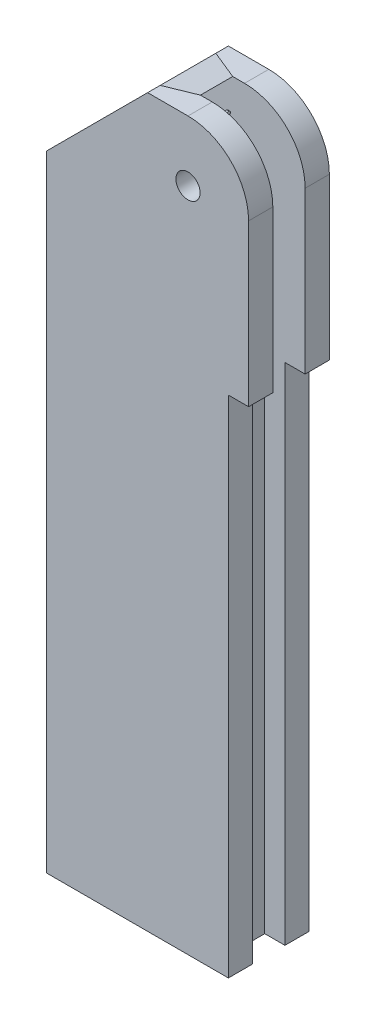
ISO-10303-21;
HEADER;
FILE_DESCRIPTION(('STEP AP214'),'2;1');
FILE_NAME('part.step','',(''),(''),'','','');
FILE_SCHEMA(('AUTOMOTIVE_DESIGN { 1 0 10303 214 1 1 1 1 }'));
ENDSEC;
DATA;
#1=APPLICATION_CONTEXT('core data for automotive mechanical design processes');
#2=APPLICATION_PROTOCOL_DEFINITION('international standard','automotive_design',2000,#1);
#3=PRODUCT_CONTEXT('',#1,'mechanical');
#4=PRODUCT('Part','Part','',(#3));
#5=PRODUCT_RELATED_PRODUCT_CATEGORY('part','',(#4));
#6=PRODUCT_DEFINITION_FORMATION('','',#4);
#7=PRODUCT_DEFINITION_CONTEXT('part definition',#1,'design');
#8=PRODUCT_DEFINITION('design','',#6,#7);
#9=PRODUCT_DEFINITION_SHAPE('','',#8);
#10=(LENGTH_UNIT() NAMED_UNIT(*) SI_UNIT(.MILLI.,.METRE.));
#11=(NAMED_UNIT(*) PLANE_ANGLE_UNIT() SI_UNIT($,.RADIAN.));
#12=(NAMED_UNIT(*) SI_UNIT($,.STERADIAN.) SOLID_ANGLE_UNIT());
#13=UNCERTAINTY_MEASURE_WITH_UNIT(LENGTH_MEASURE(1.E-05),#10,'distance_accuracy_value','');
#14=(GEOMETRIC_REPRESENTATION_CONTEXT(3) GLOBAL_UNCERTAINTY_ASSIGNED_CONTEXT((#13)) GLOBAL_UNIT_ASSIGNED_CONTEXT((#10,
#11,#12)) REPRESENTATION_CONTEXT('',''));
#15=CARTESIAN_POINT('',(0.,0.,0.));
#16=DIRECTION('',(0.,0.,1.));
#17=DIRECTION('',(1.,0.,0.));
#18=AXIS2_PLACEMENT_3D('',#15,#16,#17);
#19=CARTESIAN_POINT('',(-0.5,10.5,0.));
#20=DIRECTION('',(1.,0.,0.));
#21=DIRECTION('',(0.,0.,-1.));
#22=AXIS2_PLACEMENT_3D('',#19,#20,#21);
#23=CYLINDRICAL_SURFACE('',#22,0.5);
#24=CARTESIAN_POINT('',(-0.5,10.5,0.));
#25=DIRECTION('',(1.,0.,0.));
#26=DIRECTION('',(0.,0.,-1.));
#27=AXIS2_PLACEMENT_3D('',#24,#25,#26);
#28=CIRCLE('',#27,0.5);
#29=CARTESIAN_POINT('',(-0.5,10.5,-0.5));
#30=VERTEX_POINT('',#29);
#31=EDGE_CURVE('E11',#30,#30,#28,.T.);
#32=ORIENTED_EDGE('',*,*,#31,.T.);
#33=EDGE_LOOP('',(#32));
#34=FACE_BOUND('',#33,.T.);
#35=CARTESIAN_POINT('',(0.,10.5,0.));
#36=DIRECTION('',(1.,0.,0.));
#37=DIRECTION('',(0.,0.,-1.));
#38=AXIS2_PLACEMENT_3D('',#35,#36,#37);
#39=CIRCLE('',#38,0.5);
#40=CARTESIAN_POINT('',(0.,10.5,-0.5));
#41=VERTEX_POINT('',#40);
#42=EDGE_CURVE('E56',#41,#41,#39,.T.);
#43=ORIENTED_EDGE('',*,*,#42,.F.);
#44=EDGE_LOOP('',(#43));
#45=FACE_BOUND('',#44,.T.);
#46=ADVANCED_FACE('F49',(#34,#45),#23,.T.);
#47=CARTESIAN_POINT('',(-0.5,10.5,0.));
#48=DIRECTION('',(1.,0.,0.));
#49=DIRECTION('',(0.,0.,-1.));
#50=AXIS2_PLACEMENT_3D('',#47,#48,#49);
#51=PLANE('',#50);
#52=ORIENTED_EDGE('',*,*,#31,.F.);
#53=EDGE_LOOP('',(#52));
#54=FACE_BOUND('',#53,.T.);
#55=ADVANCED_FACE('F67',(#54),#51,.F.);
#56=CARTESIAN_POINT('',(0.,10.5,0.));
#57=DIRECTION('',(1.,0.,0.));
#58=DIRECTION('',(0.,0.,-1.));
#59=AXIS2_PLACEMENT_3D('',#56,#57,#58);
#60=PLANE('',#59);
#61=ORIENTED_EDGE('',*,*,#42,.T.);
#62=EDGE_LOOP('',(#61));
#63=FACE_BOUND('',#62,.T.);
#64=ADVANCED_FACE('F64',(#63),#60,.T.);
#65=CLOSED_SHELL('',(#46,#55,#64));
#66=MANIFOLD_SOLID_BREP('B2',#65);
#67=CARTESIAN_POINT('',(10.,-39.85,10.));
#68=DIRECTION('',(-1.,0.,0.));
#69=DIRECTION('',(0.,-1.,0.));
#70=AXIS2_PLACEMENT_3D('',#67,#68,#69);
#71=PLANE('',#70);
#72=DIRECTION('',(0.,0.,-1.));
#73=VECTOR('',#72,1.);
#74=CARTESIAN_POINT('',(10.,-39.85,10.));
#75=LINE('',#74,#73);
#76=CARTESIAN_POINT('',(10.,-39.85,-4.));
#77=VERTEX_POINT('',#76);
#78=CARTESIAN_POINT('',(10.,-39.85,-10.));
#79=VERTEX_POINT('',#78);
#80=EDGE_CURVE('E374',#77,#79,#75,.T.);
#81=ORIENTED_EDGE('',*,*,#80,.F.);
#82=DIRECTION('',(0.,-1.,0.));
#83=VECTOR('',#82,1.);
#84=CARTESIAN_POINT('',(10.,-39.85,-4.));
#85=LINE('',#84,#83);
#86=CARTESIAN_POINT('',(10.,-164.85,-4.));
#87=VERTEX_POINT('',#86);
#88=EDGE_CURVE('E453',#77,#87,#85,.T.);
#89=ORIENTED_EDGE('',*,*,#88,.T.);
#90=DIRECTION('',(0.,0.,-1.));
#91=VECTOR('',#90,1.);
#92=CARTESIAN_POINT('',(10.,-164.85,10.));
#93=LINE('',#92,#91);
#94=CARTESIAN_POINT('',(10.,-164.85,-10.));
#95=VERTEX_POINT('',#94);
#96=EDGE_CURVE('E379',#87,#95,#93,.T.);
#97=ORIENTED_EDGE('',*,*,#96,.T.);
#98=DIRECTION('',(0.,1.,0.));
#99=VECTOR('',#98,1.);
#100=CARTESIAN_POINT('',(10.,-39.85,-10.));
#101=LINE('',#100,#99);
#102=EDGE_CURVE('E297',#95,#79,#101,.T.);
#103=ORIENTED_EDGE('',*,*,#102,.T.);
#104=EDGE_LOOP('',(#81,#89,#97,#103));
#105=FACE_BOUND('',#104,.T.);
#106=ADVANCED_FACE('F99',(#105),#71,.F.);
#107=CARTESIAN_POINT('',(15.,-39.85,10.));
#108=DIRECTION('',(0.,1.,0.));
#109=DIRECTION('',(0.,0.,1.));
#110=AXIS2_PLACEMENT_3D('',#107,#108,#109);
#111=PLANE('',#110);
#112=DIRECTION('',(0.,0.,-1.));
#113=VECTOR('',#112,1.);
#114=CARTESIAN_POINT('',(15.,-39.85,10.));
#115=LINE('',#114,#113);
#116=CARTESIAN_POINT('',(15.,-39.85,-4.));
#117=VERTEX_POINT('',#116);
#118=CARTESIAN_POINT('',(15.,-39.85,-10.));
#119=VERTEX_POINT('',#118);
#120=EDGE_CURVE('E369',#117,#119,#115,.T.);
#121=ORIENTED_EDGE('',*,*,#120,.F.);
#122=DIRECTION('',(-1.,0.,0.));
#123=VECTOR('',#122,1.);
#124=CARTESIAN_POINT('',(15.,-39.85,-4.));
#125=LINE('',#124,#123);
#126=EDGE_CURVE('E458',#117,#77,#125,.T.);
#127=ORIENTED_EDGE('',*,*,#126,.T.);
#128=ORIENTED_EDGE('',*,*,#80,.T.);
#129=DIRECTION('',(1.,0.,0.));
#130=VECTOR('',#129,1.);
#131=CARTESIAN_POINT('',(15.,-39.85,-10.));
#132=LINE('',#131,#130);
#133=EDGE_CURVE('E301',#79,#119,#132,.T.);
#134=ORIENTED_EDGE('',*,*,#133,.T.);
#135=EDGE_LOOP('',(#121,#127,#128,#134));
#136=FACE_BOUND('',#135,.T.);
#137=ADVANCED_FACE('F527',(#136),#111,.F.);
#138=CARTESIAN_POINT('',(15.,0.,10.));
#139=DIRECTION('',(-1.,0.,0.));
#140=DIRECTION('',(0.,-1.,0.));
#141=AXIS2_PLACEMENT_3D('',#138,#139,#140);
#142=PLANE('',#141);
#143=DIRECTION('',(0.,1.,0.));
#144=VECTOR('',#143,1.);
#145=CARTESIAN_POINT('',(15.,-15.,-4.));
#146=LINE('',#145,#144);
#147=CARTESIAN_POINT('',(15.,0.,-4.));
#148=VERTEX_POINT('',#147);
#149=EDGE_CURVE('E452',#117,#148,#146,.T.);
#150=ORIENTED_EDGE('',*,*,#149,.F.);
#151=ORIENTED_EDGE('',*,*,#120,.T.);
#152=DIRECTION('',(0.,1.,0.));
#153=VECTOR('',#152,1.);
#154=CARTESIAN_POINT('',(15.,0.,-10.));
#155=LINE('',#154,#153);
#156=CARTESIAN_POINT('',(15.,0.,-10.));
#157=VERTEX_POINT('',#156);
#158=EDGE_CURVE('E305',#119,#157,#155,.T.);
#159=ORIENTED_EDGE('',*,*,#158,.T.);
#160=DIRECTION('',(0.,0.,-1.));
#161=VECTOR('',#160,1.);
#162=CARTESIAN_POINT('',(15.,0.,10.));
#163=LINE('',#162,#161);
#164=EDGE_CURVE('E364',#148,#157,#163,.T.);
#165=ORIENTED_EDGE('',*,*,#164,.F.);
#166=EDGE_LOOP('',(#150,#151,#159,#165));
#167=FACE_BOUND('',#166,.T.);
#168=ADVANCED_FACE('F525',(#167),#142,.F.);
#169=CARTESIAN_POINT('',(0.,0.,10.));
#170=DIRECTION('',(0.,0.,-1.));
#171=DIRECTION('',(-1.,0.,0.));
#172=AXIS2_PLACEMENT_3D('',#169,#170,#171);
#173=CYLINDRICAL_SURFACE('',#172,15.);
#174=CARTESIAN_POINT('',(15.,0.,10.));
#175=VERTEX_POINT('',#174);
#176=CARTESIAN_POINT('',(15.,0.,4.));
#177=VERTEX_POINT('',#176);
#178=EDGE_CURVE('E365',#175,#177,#163,.T.);
#179=ORIENTED_EDGE('',*,*,#178,.T.);
#180=CARTESIAN_POINT('',(0.,0.,4.));
#181=DIRECTION('',(0.,0.,1.));
#182=DIRECTION('',(1.,0.,0.));
#183=AXIS2_PLACEMENT_3D('',#180,#181,#182);
#184=CIRCLE('',#183,15.);
#185=CARTESIAN_POINT('',(0.,15.,4.));
#186=VERTEX_POINT('',#185);
#187=EDGE_CURVE('E281',#177,#186,#184,.T.);
#188=ORIENTED_EDGE('',*,*,#187,.T.);
#189=DIRECTION('',(0.,0.,-1.));
#190=VECTOR('',#189,1.);
#191=CARTESIAN_POINT('',(0.,15.,10.));
#192=LINE('',#191,#190);
#193=CARTESIAN_POINT('',(0.,15.,10.));
#194=VERTEX_POINT('',#193);
#195=EDGE_CURVE('E360',#194,#186,#192,.T.);
#196=ORIENTED_EDGE('',*,*,#195,.F.);
#197=CARTESIAN_POINT('',(0.,0.,10.));
#198=DIRECTION('',(0.,0.,1.));
#199=DIRECTION('',(-1.,0.,0.));
#200=AXIS2_PLACEMENT_3D('',#197,#198,#199);
#201=CIRCLE('',#200,15.);
#202=EDGE_CURVE('E340',#175,#194,#201,.T.);
#203=ORIENTED_EDGE('',*,*,#202,.F.);
#204=EDGE_LOOP('',(#179,#188,#196,#203));
#205=FACE_BOUND('',#204,.T.);
#206=ADVANCED_FACE('F442',(#205),#173,.T.);
#207=CARTESIAN_POINT('',(-10.,15.,10.));
#208=DIRECTION('',(0.,-1.,0.));
#209=DIRECTION('',(1.,0.,0.));
#210=AXIS2_PLACEMENT_3D('',#207,#208,#209);
#211=PLANE('',#210);
#212=DIRECTION('',(-1.,0.,0.));
#213=VECTOR('',#212,1.);
#214=CARTESIAN_POINT('',(-10.,15.,4.));
#215=LINE('',#214,#213);
#216=CARTESIAN_POINT('',(-2.92893218813455,15.,4.));
#217=VERTEX_POINT('',#216);
#218=EDGE_CURVE('E277',#186,#217,#215,.T.);
#219=ORIENTED_EDGE('',*,*,#218,.T.);
#220=DIRECTION('',(0.925820099772552,0.,-0.377964473009226));
#221=VECTOR('',#220,1.);
#222=CARTESIAN_POINT('',(-31.4285714285714,15.,15.6349289987451));
#223=LINE('',#222,#221);
#224=CARTESIAN_POINT('',(-10.,15.,6.88675134594811));
#225=VERTEX_POINT('',#224);
#226=EDGE_CURVE('E404',#217,#225,#223,.F.);
#227=ORIENTED_EDGE('',*,*,#226,.T.);
#228=DIRECTION('',(0.,0.,-1.));
#229=VECTOR('',#228,1.);
#230=CARTESIAN_POINT('',(-10.,15.,10.));
#231=LINE('',#230,#229);
#232=CARTESIAN_POINT('',(-10.,15.,10.));
#233=VERTEX_POINT('',#232);
#234=EDGE_CURVE('E355',#233,#225,#231,.T.);
#235=ORIENTED_EDGE('',*,*,#234,.F.);
#236=DIRECTION('',(-1.,0.,0.));
#237=VECTOR('',#236,1.);
#238=CARTESIAN_POINT('',(-10.,15.,10.));
#239=LINE('',#238,#237);
#240=EDGE_CURVE('E343',#194,#233,#239,.T.);
#241=ORIENTED_EDGE('',*,*,#240,.F.);
#242=ORIENTED_EDGE('',*,*,#195,.T.);
#243=EDGE_LOOP('',(#219,#227,#235,#241,#242));
#244=FACE_BOUND('',#243,.T.);
#245=ADVANCED_FACE('F428',(#244),#211,.F.);
#246=CARTESIAN_POINT('',(-35.,-10.0000000000001,10.));
#247=DIRECTION('',(0.707106781186549,-0.707106781186546,0.));
#248=DIRECTION('',(0.707106781186546,0.707106781186549,0.));
#249=AXIS2_PLACEMENT_3D('',#246,#247,#248);
#250=PLANE('',#249);
#251=ORIENTED_EDGE('',*,*,#234,.T.);
#252=DIRECTION('',(-0.707106781186546,-0.707106781186549,0.));
#253=VECTOR('',#252,1.);
#254=CARTESIAN_POINT('',(-35.,-10.0000000000001,6.88675134594811));
#255=LINE('',#254,#253);
#256=CARTESIAN_POINT('',(-35.,-10.0000000000001,6.88675134594811));
#257=VERTEX_POINT('',#256);
#258=EDGE_CURVE('E386',#225,#257,#255,.T.);
#259=ORIENTED_EDGE('',*,*,#258,.T.);
#260=DIRECTION('',(0.,0.,-1.));
#261=VECTOR('',#260,1.);
#262=CARTESIAN_POINT('',(-35.,-10.0000000000001,10.));
#263=LINE('',#262,#261);
#264=CARTESIAN_POINT('',(-35.,-10.0000000000001,10.));
#265=VERTEX_POINT('',#264);
#266=EDGE_CURVE('E350',#265,#257,#263,.T.);
#267=ORIENTED_EDGE('',*,*,#266,.F.);
#268=DIRECTION('',(-0.707106781186546,-0.707106781186549,0.));
#269=VECTOR('',#268,1.);
#270=CARTESIAN_POINT('',(-35.,-10.0000000000001,10.));
#271=LINE('',#270,#269);
#272=EDGE_CURVE('E346',#233,#265,#271,.T.);
#273=ORIENTED_EDGE('',*,*,#272,.F.);
#274=EDGE_LOOP('',(#251,#259,#267,#273));
#275=FACE_BOUND('',#274,.T.);
#276=ADVANCED_FACE('F432',(#275),#250,.F.);
#277=CARTESIAN_POINT('',(0.,0.,10.));
#278=DIRECTION('',(0.,0.,-1.));
#279=DIRECTION('',(-1.,0.,0.));
#280=AXIS2_PLACEMENT_3D('',#277,#278,#279);
#281=CYLINDRICAL_SURFACE('',#280,3.);
#282=CARTESIAN_POINT('',(0.,0.,4.));
#283=DIRECTION('',(0.,0.,1.));
#284=DIRECTION('',(1.,0.,0.));
#285=AXIS2_PLACEMENT_3D('',#282,#283,#284);
#286=CIRCLE('',#285,3.);
#287=CARTESIAN_POINT('',(3.,0.,4.));
#288=VERTEX_POINT('',#287);
#289=EDGE_CURVE('E276',#288,#288,#286,.T.);
#290=ORIENTED_EDGE('',*,*,#289,.F.);
#291=EDGE_LOOP('',(#290));
#292=FACE_BOUND('',#291,.T.);
#293=CARTESIAN_POINT('',(0.,0.,10.));
#294=DIRECTION('',(0.,0.,1.));
#295=DIRECTION('',(1.,0.,0.));
#296=AXIS2_PLACEMENT_3D('',#293,#294,#295);
#297=CIRCLE('',#296,3.);
#298=CARTESIAN_POINT('',(3.,0.,10.));
#299=VERTEX_POINT('',#298);
#300=EDGE_CURVE('E321',#299,#299,#297,.T.);
#301=ORIENTED_EDGE('',*,*,#300,.T.);
#302=EDGE_LOOP('',(#301));
#303=FACE_BOUND('',#302,.T.);
#304=ADVANCED_FACE('F554',(#292,#303),#281,.F.);
#305=CARTESIAN_POINT('',(0.,0.,10.));
#306=DIRECTION('',(0.,0.,-1.));
#307=DIRECTION('',(-1.,0.,0.));
#308=AXIS2_PLACEMENT_3D('',#305,#306,#307);
#309=PLANE('',#308);
#310=DIRECTION('',(0.,-1.,0.));
#311=VECTOR('',#310,1.);
#312=CARTESIAN_POINT('',(-35.,-164.85,10.));
#313=LINE('',#312,#311);
#314=CARTESIAN_POINT('',(-35.,-164.85,10.));
#315=VERTEX_POINT('',#314);
#316=EDGE_CURVE('E325',#265,#315,#313,.T.);
#317=ORIENTED_EDGE('',*,*,#316,.T.);
#318=DIRECTION('',(1.,0.,0.));
#319=VECTOR('',#318,1.);
#320=CARTESIAN_POINT('',(10.,-164.85,10.));
#321=LINE('',#320,#319);
#322=CARTESIAN_POINT('',(10.,-164.85,10.));
#323=VERTEX_POINT('',#322);
#324=EDGE_CURVE('E328',#315,#323,#321,.T.);
#325=ORIENTED_EDGE('',*,*,#324,.T.);
#326=DIRECTION('',(0.,1.,0.));
#327=VECTOR('',#326,1.);
#328=CARTESIAN_POINT('',(10.,-39.85,10.));
#329=LINE('',#328,#327);
#330=CARTESIAN_POINT('',(10.,-39.85,10.));
#331=VERTEX_POINT('',#330);
#332=EDGE_CURVE('E331',#323,#331,#329,.T.);
#333=ORIENTED_EDGE('',*,*,#332,.T.);
#334=DIRECTION('',(1.,0.,0.));
#335=VECTOR('',#334,1.);
#336=CARTESIAN_POINT('',(15.,-39.85,10.));
#337=LINE('',#336,#335);
#338=CARTESIAN_POINT('',(15.,-39.85,10.));
#339=VERTEX_POINT('',#338);
#340=EDGE_CURVE('E334',#331,#339,#337,.T.);
#341=ORIENTED_EDGE('',*,*,#340,.T.);
#342=DIRECTION('',(0.,1.,0.));
#343=VECTOR('',#342,1.);
#344=CARTESIAN_POINT('',(15.,0.,10.));
#345=LINE('',#344,#343);
#346=EDGE_CURVE('E337',#339,#175,#345,.T.);
#347=ORIENTED_EDGE('',*,*,#346,.T.);
#348=ORIENTED_EDGE('',*,*,#202,.T.);
#349=ORIENTED_EDGE('',*,*,#240,.T.);
#350=ORIENTED_EDGE('',*,*,#272,.T.);
#351=EDGE_LOOP('',(#317,#325,#333,#341,#347,#348,#349,#350));
#352=FACE_BOUND('',#351,.T.);
#353=ORIENTED_EDGE('',*,*,#300,.F.);
#354=EDGE_LOOP('',(#353));
#355=FACE_BOUND('',#354,.T.);
#356=ADVANCED_FACE('F436',(#352,#355),#309,.F.);
#357=CARTESIAN_POINT('',(-35.,-164.85,10.));
#358=DIRECTION('',(1.,0.,0.));
#359=DIRECTION('',(0.,1.,0.));
#360=AXIS2_PLACEMENT_3D('',#357,#358,#359);
#361=PLANE('',#360);
#362=DIRECTION('',(0.,0.925820099772553,0.377964473009224));
#363=VECTOR('',#362,1.);
#364=CARTESIAN_POINT('',(-35.,-10.0000000000001,6.88675134594811));
#365=LINE('',#364,#363);
#366=CARTESIAN_POINT('',(-35.,-15.,4.84550989362885));
#367=VERTEX_POINT('',#366);
#368=EDGE_CURVE('E397',#257,#367,#365,.F.);
#369=ORIENTED_EDGE('',*,*,#368,.T.);
#370=DIRECTION('',(0.,0.,-1.));
#371=VECTOR('',#370,1.);
#372=CARTESIAN_POINT('',(-35.,-15.,4.));
#373=LINE('',#372,#371);
#374=CARTESIAN_POINT('',(-35.,-15.,-4.84550989362885));
#375=VERTEX_POINT('',#374);
#376=EDGE_CURVE('E265',#367,#375,#373,.T.);
#377=ORIENTED_EDGE('',*,*,#376,.T.);
#378=DIRECTION('',(0.,-0.925820099772553,0.377964473009224));
#379=VECTOR('',#378,1.);
#380=CARTESIAN_POINT('',(-35.,-10.0000000000001,-6.88675134594811));
#381=LINE('',#380,#379);
#382=CARTESIAN_POINT('',(-35.,-10.0000000000001,-6.88675134594811));
#383=VERTEX_POINT('',#382);
#384=EDGE_CURVE('E394',#375,#383,#381,.F.);
#385=ORIENTED_EDGE('',*,*,#384,.T.);
#386=CARTESIAN_POINT('',(-35.,-10.0000000000001,-10.));
#387=VERTEX_POINT('',#386);
#388=EDGE_CURVE('E349',#383,#387,#263,.T.);
#389=ORIENTED_EDGE('',*,*,#388,.T.);
#390=DIRECTION('',(0.,-1.,0.));
#391=VECTOR('',#390,1.);
#392=CARTESIAN_POINT('',(-35.,-164.85,-10.));
#393=LINE('',#392,#391);
#394=CARTESIAN_POINT('',(-35.,-164.85,-10.));
#395=VERTEX_POINT('',#394);
#396=EDGE_CURVE('E289',#387,#395,#393,.T.);
#397=ORIENTED_EDGE('',*,*,#396,.T.);
#398=DIRECTION('',(0.,0.,-1.));
#399=VECTOR('',#398,1.);
#400=CARTESIAN_POINT('',(-35.,-164.85,10.));
#401=LINE('',#400,#399);
#402=EDGE_CURVE('E384',#315,#395,#401,.T.);
#403=ORIENTED_EDGE('',*,*,#402,.F.);
#404=ORIENTED_EDGE('',*,*,#316,.F.);
#405=ORIENTED_EDGE('',*,*,#266,.T.);
#406=EDGE_LOOP('',(#369,#377,#385,#389,#397,#403,#404,#405));
#407=FACE_BOUND('',#406,.T.);
#408=ADVANCED_FACE('F101',(#407),#361,.F.);
#409=CARTESIAN_POINT('',(10.,-164.85,10.));
#410=DIRECTION('',(0.,1.,0.));
#411=DIRECTION('',(0.,0.,1.));
#412=AXIS2_PLACEMENT_3D('',#409,#410,#411);
#413=PLANE('',#412);
#414=ORIENTED_EDGE('',*,*,#96,.F.);
#415=DIRECTION('',(-1.,0.,0.));
#416=VECTOR('',#415,1.);
#417=CARTESIAN_POINT('',(5.00000000000001,-164.85,-4.));
#418=LINE('',#417,#416);
#419=CARTESIAN_POINT('',(5.00000000000001,-164.85,-4.));
#420=VERTEX_POINT('',#419);
#421=EDGE_CURVE('E471',#87,#420,#418,.T.);
#422=ORIENTED_EDGE('',*,*,#421,.T.);
#423=DIRECTION('',(0.,0.,1.));
#424=VECTOR('',#423,1.);
#425=CARTESIAN_POINT('',(5.00000000000001,-164.85,4.));
#426=LINE('',#425,#424);
#427=CARTESIAN_POINT('',(5.00000000000001,-164.85,4.));
#428=VERTEX_POINT('',#427);
#429=EDGE_CURVE('E240',#420,#428,#426,.T.);
#430=ORIENTED_EDGE('',*,*,#429,.T.);
#431=DIRECTION('',(1.,0.,0.));
#432=VECTOR('',#431,1.);
#433=CARTESIAN_POINT('',(5.00000000000001,-164.85,4.));
#434=LINE('',#433,#432);
#435=CARTESIAN_POINT('',(10.,-164.85,4.));
#436=VERTEX_POINT('',#435);
#437=EDGE_CURVE('E475',#428,#436,#434,.T.);
#438=ORIENTED_EDGE('',*,*,#437,.T.);
#439=EDGE_CURVE('E380',#323,#436,#93,.T.);
#440=ORIENTED_EDGE('',*,*,#439,.F.);
#441=ORIENTED_EDGE('',*,*,#324,.F.);
#442=ORIENTED_EDGE('',*,*,#402,.T.);
#443=DIRECTION('',(1.,0.,0.));
#444=VECTOR('',#443,1.);
#445=CARTESIAN_POINT('',(10.,-164.85,-10.));
#446=LINE('',#445,#444);
#447=EDGE_CURVE('E293',#395,#95,#446,.T.);
#448=ORIENTED_EDGE('',*,*,#447,.T.);
#449=EDGE_LOOP('',(#414,#422,#430,#438,#440,#441,#442,#448));
#450=FACE_BOUND('',#449,.T.);
#451=ADVANCED_FACE('F482',(#450),#413,.F.);
#452=ORIENTED_EDGE('',*,*,#439,.T.);
#453=DIRECTION('',(0.,1.,0.));
#454=VECTOR('',#453,1.);
#455=CARTESIAN_POINT('',(10.,-39.85,4.));
#456=LINE('',#455,#454);
#457=CARTESIAN_POINT('',(10.,-39.85,4.));
#458=VERTEX_POINT('',#457);
#459=EDGE_CURVE('E464',#436,#458,#456,.T.);
#460=ORIENTED_EDGE('',*,*,#459,.T.);
#461=EDGE_CURVE('E375',#331,#458,#75,.T.);
#462=ORIENTED_EDGE('',*,*,#461,.F.);
#463=ORIENTED_EDGE('',*,*,#332,.F.);
#464=EDGE_LOOP('',(#452,#460,#462,#463));
#465=FACE_BOUND('',#464,.T.);
#466=ADVANCED_FACE('F532',(#465),#71,.F.);
#467=ORIENTED_EDGE('',*,*,#461,.T.);
#468=DIRECTION('',(1.,0.,0.));
#469=VECTOR('',#468,1.);
#470=CARTESIAN_POINT('',(15.,-39.85,4.));
#471=LINE('',#470,#469);
#472=CARTESIAN_POINT('',(15.,-39.85,4.));
#473=VERTEX_POINT('',#472);
#474=EDGE_CURVE('E243',#458,#473,#471,.T.);
#475=ORIENTED_EDGE('',*,*,#474,.T.);
#476=EDGE_CURVE('E370',#339,#473,#115,.T.);
#477=ORIENTED_EDGE('',*,*,#476,.F.);
#478=ORIENTED_EDGE('',*,*,#340,.F.);
#479=EDGE_LOOP('',(#467,#475,#477,#478));
#480=FACE_BOUND('',#479,.T.);
#481=ADVANCED_FACE('F534',(#480),#111,.F.);
#482=ORIENTED_EDGE('',*,*,#476,.T.);
#483=DIRECTION('',(0.,-1.,0.));
#484=VECTOR('',#483,1.);
#485=CARTESIAN_POINT('',(15.,-15.,4.));
#486=LINE('',#485,#484);
#487=EDGE_CURVE('E445',#177,#473,#486,.T.);
#488=ORIENTED_EDGE('',*,*,#487,.F.);
#489=ORIENTED_EDGE('',*,*,#178,.F.);
#490=ORIENTED_EDGE('',*,*,#346,.F.);
#491=EDGE_LOOP('',(#482,#488,#489,#490));
#492=FACE_BOUND('',#491,.T.);
#493=ADVANCED_FACE('F448',(#492),#142,.F.);
#494=CARTESIAN_POINT('',(0.,15.,-4.));
#495=VERTEX_POINT('',#494);
#496=CARTESIAN_POINT('',(0.,15.,-10.));
#497=VERTEX_POINT('',#496);
#498=EDGE_CURVE('E359',#495,#497,#192,.T.);
#499=ORIENTED_EDGE('',*,*,#498,.F.);
#500=CARTESIAN_POINT('',(0.,0.,-4.));
#501=DIRECTION('',(0.,0.,-1.));
#502=DIRECTION('',(-1.,0.,0.));
#503=AXIS2_PLACEMENT_3D('',#500,#501,#502);
#504=CIRCLE('',#503,15.);
#505=EDGE_CURVE('E272',#495,#148,#504,.T.);
#506=ORIENTED_EDGE('',*,*,#505,.T.);
#507=ORIENTED_EDGE('',*,*,#164,.T.);
#508=CARTESIAN_POINT('',(0.,0.,-10.));
#509=DIRECTION('',(0.,0.,1.));
#510=DIRECTION('',(-1.,0.,0.));
#511=AXIS2_PLACEMENT_3D('',#508,#509,#510);
#512=CIRCLE('',#511,15.);
#513=EDGE_CURVE('E309',#157,#497,#512,.T.);
#514=ORIENTED_EDGE('',*,*,#513,.T.);
#515=EDGE_LOOP('',(#499,#506,#507,#514));
#516=FACE_BOUND('',#515,.T.);
#517=ADVANCED_FACE('F522',(#516),#173,.T.);
#518=CARTESIAN_POINT('',(-10.,15.,-6.8867513459481));
#519=VERTEX_POINT('',#518);
#520=CARTESIAN_POINT('',(-10.,15.,-10.));
#521=VERTEX_POINT('',#520);
#522=EDGE_CURVE('E354',#519,#521,#231,.T.);
#523=ORIENTED_EDGE('',*,*,#522,.F.);
#524=DIRECTION('',(-0.925820099772552,0.,-0.377964473009226));
#525=VECTOR('',#524,1.);
#526=CARTESIAN_POINT('',(-31.4285714285714,15.,-15.6349289987451));
#527=LINE('',#526,#525);
#528=CARTESIAN_POINT('',(-2.92893218813454,15.,-4.));
#529=VERTEX_POINT('',#528);
#530=EDGE_CURVE('E411',#519,#529,#527,.F.);
#531=ORIENTED_EDGE('',*,*,#530,.T.);
#532=DIRECTION('',(1.,0.,0.));
#533=VECTOR('',#532,1.);
#534=CARTESIAN_POINT('',(-10.,15.,-4.));
#535=LINE('',#534,#533);
#536=EDGE_CURVE('E262',#529,#495,#535,.T.);
#537=ORIENTED_EDGE('',*,*,#536,.T.);
#538=ORIENTED_EDGE('',*,*,#498,.T.);
#539=DIRECTION('',(-1.,0.,0.));
#540=VECTOR('',#539,1.);
#541=CARTESIAN_POINT('',(-10.,15.,-10.));
#542=LINE('',#541,#540);
#543=EDGE_CURVE('E313',#497,#521,#542,.T.);
#544=ORIENTED_EDGE('',*,*,#543,.T.);
#545=EDGE_LOOP('',(#523,#531,#537,#538,#544));
#546=FACE_BOUND('',#545,.T.);
#547=ADVANCED_FACE('F507',(#546),#211,.F.);
#548=ORIENTED_EDGE('',*,*,#388,.F.);
#549=DIRECTION('',(0.707106781186546,0.707106781186549,0.));
#550=VECTOR('',#549,1.);
#551=CARTESIAN_POINT('',(-35.,-10.0000000000001,-6.88675134594811));
#552=LINE('',#551,#550);
#553=EDGE_CURVE('E407',#383,#519,#552,.T.);
#554=ORIENTED_EDGE('',*,*,#553,.T.);
#555=ORIENTED_EDGE('',*,*,#522,.T.);
#556=DIRECTION('',(-0.707106781186546,-0.707106781186549,0.));
#557=VECTOR('',#556,1.);
#558=CARTESIAN_POINT('',(-35.,-10.0000000000001,-10.));
#559=LINE('',#558,#557);
#560=EDGE_CURVE('E317',#521,#387,#559,.T.);
#561=ORIENTED_EDGE('',*,*,#560,.T.);
#562=EDGE_LOOP('',(#548,#554,#555,#561));
#563=FACE_BOUND('',#562,.T.);
#564=ADVANCED_FACE('F502',(#563),#250,.F.);
#565=CARTESIAN_POINT('',(0.,0.,-4.));
#566=DIRECTION('',(0.,0.,-1.));
#567=DIRECTION('',(-1.,0.,0.));
#568=AXIS2_PLACEMENT_3D('',#565,#566,#567);
#569=CIRCLE('',#568,3.);
#570=CARTESIAN_POINT('',(-3.,0.,-4.));
#571=VERTEX_POINT('',#570);
#572=EDGE_CURVE('E257',#571,#571,#569,.T.);
#573=ORIENTED_EDGE('',*,*,#572,.F.);
#574=EDGE_LOOP('',(#573));
#575=FACE_BOUND('',#574,.T.);
#576=CARTESIAN_POINT('',(0.,0.,-10.));
#577=DIRECTION('',(0.,0.,1.));
#578=DIRECTION('',(1.,0.,0.));
#579=AXIS2_PLACEMENT_3D('',#576,#577,#578);
#580=CIRCLE('',#579,3.);
#581=CARTESIAN_POINT('',(3.,0.,-10.));
#582=VERTEX_POINT('',#581);
#583=EDGE_CURVE('E285',#582,#582,#580,.T.);
#584=ORIENTED_EDGE('',*,*,#583,.F.);
#585=EDGE_LOOP('',(#584));
#586=FACE_BOUND('',#585,.T.);
#587=ADVANCED_FACE('F561',(#575,#586),#281,.F.);
#588=CARTESIAN_POINT('',(0.,0.,-10.));
#589=DIRECTION('',(0.,0.,-1.));
#590=DIRECTION('',(-1.,0.,0.));
#591=AXIS2_PLACEMENT_3D('',#588,#589,#590);
#592=PLANE('',#591);
#593=ORIENTED_EDGE('',*,*,#583,.T.);
#594=EDGE_LOOP('',(#593));
#595=FACE_BOUND('',#594,.T.);
#596=ORIENTED_EDGE('',*,*,#396,.F.);
#597=ORIENTED_EDGE('',*,*,#560,.F.);
#598=ORIENTED_EDGE('',*,*,#543,.F.);
#599=ORIENTED_EDGE('',*,*,#513,.F.);
#600=ORIENTED_EDGE('',*,*,#158,.F.);
#601=ORIENTED_EDGE('',*,*,#133,.F.);
#602=ORIENTED_EDGE('',*,*,#102,.F.);
#603=ORIENTED_EDGE('',*,*,#447,.F.);
#604=EDGE_LOOP('',(#596,#597,#598,#599,#600,#601,#602,#603));
#605=FACE_BOUND('',#604,.T.);
#606=ADVANCED_FACE('F512',(#595,#605),#592,.T.);
#607=CARTESIAN_POINT('',(-35.,-15.,4.));
#608=DIRECTION('',(0.,0.,1.));
#609=DIRECTION('',(1.,0.,0.));
#610=AXIS2_PLACEMENT_3D('',#607,#608,#609);
#611=PLANE('',#610);
#612=ORIENTED_EDGE('',*,*,#289,.T.);
#613=EDGE_LOOP('',(#612));
#614=FACE_BOUND('',#613,.T.);
#615=DIRECTION('',(1.,0.,0.));
#616=VECTOR('',#615,1.);
#617=CARTESIAN_POINT('',(-35.,-15.,4.));
#618=LINE('',#617,#616);
#619=CARTESIAN_POINT('',(-32.9289321881344,-15.,4.));
#620=VERTEX_POINT('',#619);
#621=CARTESIAN_POINT('',(5.,-15.,4.));
#622=VERTEX_POINT('',#621);
#623=EDGE_CURVE('E252',#620,#622,#618,.T.);
#624=ORIENTED_EDGE('',*,*,#623,.F.);
#625=DIRECTION('',(0.707106781186546,0.707106781186549,0.));
#626=VECTOR('',#625,1.);
#627=CARTESIAN_POINT('',(-33.9644660940672,-16.0355339059328,4.));
#628=LINE('',#627,#626);
#629=EDGE_CURVE('E401',#620,#217,#628,.T.);
#630=ORIENTED_EDGE('',*,*,#629,.T.);
#631=ORIENTED_EDGE('',*,*,#218,.F.);
#632=ORIENTED_EDGE('',*,*,#187,.F.);
#633=ORIENTED_EDGE('',*,*,#487,.T.);
#634=ORIENTED_EDGE('',*,*,#474,.F.);
#635=ORIENTED_EDGE('',*,*,#459,.F.);
#636=ORIENTED_EDGE('',*,*,#437,.F.);
#637=DIRECTION('',(0.,1.,0.));
#638=VECTOR('',#637,1.);
#639=CARTESIAN_POINT('',(5.00000000000001,-164.85,4.));
#640=LINE('',#639,#638);
#641=EDGE_CURVE('E244',#428,#622,#640,.T.);
#642=ORIENTED_EDGE('',*,*,#641,.T.);
#643=EDGE_LOOP('',(#624,#630,#631,#632,#633,#634,#635,#636,#642));
#644=FACE_BOUND('',#643,.T.);
#645=ADVANCED_FACE('F421',(#614,#644),#611,.F.);
#646=CARTESIAN_POINT('',(-35.,-15.,-4.));
#647=DIRECTION('',(0.,0.,-1.));
#648=DIRECTION('',(-1.,0.,0.));
#649=AXIS2_PLACEMENT_3D('',#646,#647,#648);
#650=PLANE('',#649);
#651=ORIENTED_EDGE('',*,*,#572,.T.);
#652=EDGE_LOOP('',(#651));
#653=FACE_BOUND('',#652,.T.);
#654=ORIENTED_EDGE('',*,*,#536,.F.);
#655=DIRECTION('',(-0.707106781186546,-0.707106781186549,0.));
#656=VECTOR('',#655,1.);
#657=CARTESIAN_POINT('',(-33.9644660940672,-16.0355339059328,-4.));
#658=LINE('',#657,#656);
#659=CARTESIAN_POINT('',(-32.9289321881344,-15.,-4.));
#660=VERTEX_POINT('',#659);
#661=EDGE_CURVE('E123',#529,#660,#658,.T.);
#662=ORIENTED_EDGE('',*,*,#661,.T.);
#663=DIRECTION('',(1.,0.,0.));
#664=VECTOR('',#663,1.);
#665=CARTESIAN_POINT('',(-35.,-15.,-4.));
#666=LINE('',#665,#664);
#667=CARTESIAN_POINT('',(5.,-15.,-4.));
#668=VERTEX_POINT('',#667);
#669=EDGE_CURVE('E249',#660,#668,#666,.T.);
#670=ORIENTED_EDGE('',*,*,#669,.T.);
#671=DIRECTION('',(0.,1.,0.));
#672=VECTOR('',#671,1.);
#673=CARTESIAN_POINT('',(5.00000000000001,-164.85,-4.));
#674=LINE('',#673,#672);
#675=EDGE_CURVE('E237',#420,#668,#674,.T.);
#676=ORIENTED_EDGE('',*,*,#675,.F.);
#677=ORIENTED_EDGE('',*,*,#421,.F.);
#678=ORIENTED_EDGE('',*,*,#88,.F.);
#679=ORIENTED_EDGE('',*,*,#126,.F.);
#680=ORIENTED_EDGE('',*,*,#149,.T.);
#681=ORIENTED_EDGE('',*,*,#505,.F.);
#682=EDGE_LOOP('',(#654,#662,#670,#676,#677,#678,#679,#680,#681));
#683=FACE_BOUND('',#682,.T.);
#684=ADVANCED_FACE('F255',(#653,#683),#650,.F.);
#685=CARTESIAN_POINT('',(-35.,-15.,4.));
#686=DIRECTION('',(0.,-1.,0.));
#687=DIRECTION('',(1.,0.,0.));
#688=AXIS2_PLACEMENT_3D('',#685,#686,#687);
#689=PLANE('',#688);
#690=ORIENTED_EDGE('',*,*,#623,.T.);
#691=DIRECTION('',(0.,0.,1.));
#692=VECTOR('',#691,1.);
#693=CARTESIAN_POINT('',(5.,-15.,4.));
#694=LINE('',#693,#692);
#695=EDGE_CURVE('E115',#668,#622,#694,.T.);
#696=ORIENTED_EDGE('',*,*,#695,.F.);
#697=ORIENTED_EDGE('',*,*,#669,.F.);
#698=DIRECTION('',(0.925820099772552,0.,0.377964473009225));
#699=VECTOR('',#698,1.);
#700=CARTESIAN_POINT('',(-31.9047163208384,-15.,-3.58186562311046));
#701=LINE('',#700,#699);
#702=EDGE_CURVE('E47',#660,#375,#701,.F.);
#703=ORIENTED_EDGE('',*,*,#702,.T.);
#704=ORIENTED_EDGE('',*,*,#376,.F.);
#705=DIRECTION('',(-0.925820099772552,0.,0.377964473009226));
#706=VECTOR('',#705,1.);
#707=CARTESIAN_POINT('',(-34.7041331697335,-15.,4.72472276596759));
#708=LINE('',#707,#706);
#709=EDGE_CURVE('E108',#367,#620,#708,.F.);
#710=ORIENTED_EDGE('',*,*,#709,.T.);
#711=EDGE_LOOP('',(#690,#696,#697,#703,#704,#710));
#712=FACE_BOUND('',#711,.T.);
#713=ADVANCED_FACE('F248',(#712),#689,.F.);
#714=CARTESIAN_POINT('',(-35.,-10.0000000000001,6.88675134594811));
#715=DIRECTION('',(0.353553390593273,-0.353553390593271,0.86602540378444));
#716=DIRECTION('',(0.925820099772552,0.,-0.377964473009226));
#717=AXIS2_PLACEMENT_3D('',#714,#715,#716);
#718=PLANE('',#717);
#719=ORIENTED_EDGE('',*,*,#226,.F.);
#720=ORIENTED_EDGE('',*,*,#629,.F.);
#721=ORIENTED_EDGE('',*,*,#709,.F.);
#722=ORIENTED_EDGE('',*,*,#368,.F.);
#723=ORIENTED_EDGE('',*,*,#258,.F.);
#724=EDGE_LOOP('',(#719,#720,#721,#722,#723));
#725=FACE_BOUND('',#724,.T.);
#726=ADVANCED_FACE('F424',(#725),#718,.F.);
#727=CARTESIAN_POINT('',(-35.,-10.0000000000001,-6.88675134594811));
#728=DIRECTION('',(0.353553390593273,-0.353553390593271,-0.86602540378444));
#729=DIRECTION('',(-0.925820099772552,0.,-0.377964473009226));
#730=AXIS2_PLACEMENT_3D('',#727,#728,#729);
#731=PLANE('',#730);
#732=ORIENTED_EDGE('',*,*,#702,.F.);
#733=ORIENTED_EDGE('',*,*,#661,.F.);
#734=ORIENTED_EDGE('',*,*,#530,.F.);
#735=ORIENTED_EDGE('',*,*,#553,.F.);
#736=ORIENTED_EDGE('',*,*,#384,.F.);
#737=EDGE_LOOP('',(#732,#733,#734,#735,#736));
#738=FACE_BOUND('',#737,.T.);
#739=ADVANCED_FACE('F518',(#738),#731,.F.);
#740=CARTESIAN_POINT('',(5.00000000000001,-164.85,4.));
#741=DIRECTION('',(-1.,0.,0.));
#742=DIRECTION('',(0.,0.,1.));
#743=AXIS2_PLACEMENT_3D('',#740,#741,#742);
#744=PLANE('',#743);
#745=ORIENTED_EDGE('',*,*,#695,.T.);
#746=ORIENTED_EDGE('',*,*,#641,.F.);
#747=ORIENTED_EDGE('',*,*,#429,.F.);
#748=ORIENTED_EDGE('',*,*,#675,.T.);
#749=EDGE_LOOP('',(#745,#746,#747,#748));
#750=FACE_BOUND('',#749,.T.);
#751=ADVANCED_FACE('F238',(#750),#744,.F.);
#752=CLOSED_SHELL('',(#106,#137,#168,#206,#245,#276,#304,#356,#408,#451,#466,#481,#493,#517,
#547,#564,#587,#606,#645,#684,#713,#726,#739,#751));
#753=MANIFOLD_SOLID_BREP('B6',#752);
#754=ADVANCED_BREP_SHAPE_REPRESENTATION('',(#18,#66,#753),#14);
#755=SHAPE_DEFINITION_REPRESENTATION(#9,#754);
ENDSEC;
END-ISO-10303-21;
